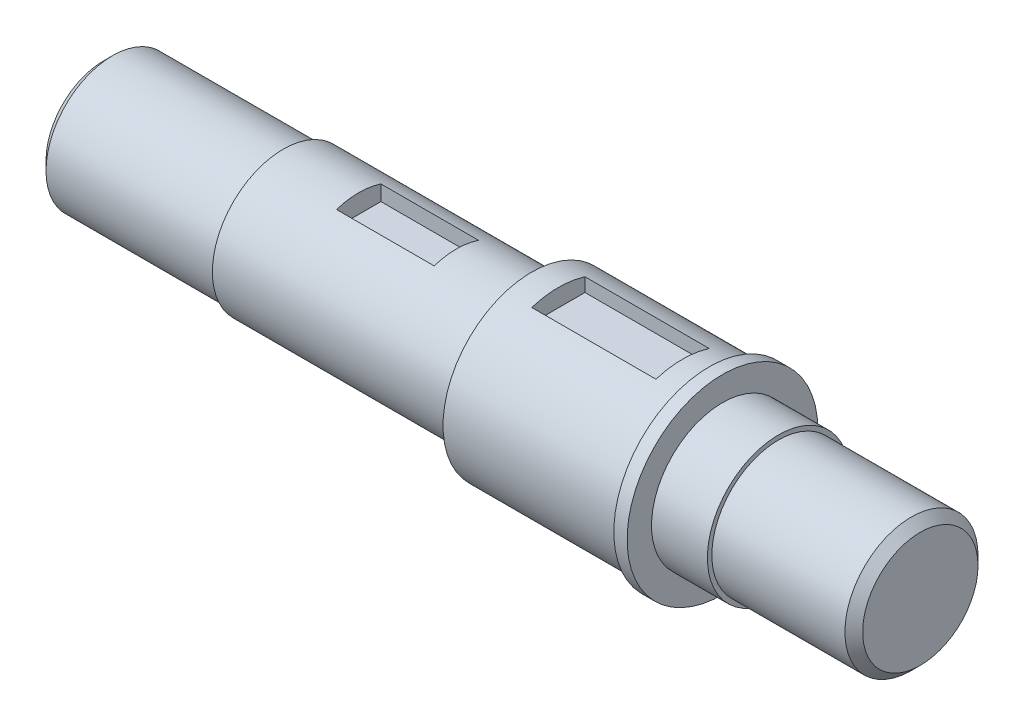
ISO-10303-21;
HEADER;
FILE_DESCRIPTION(('STEP AP214'),'2;1');
FILE_NAME('part.step','',(''),(''),'','','');
FILE_SCHEMA(('AUTOMOTIVE_DESIGN { 1 0 10303 214 1 1 1 1 }'));
ENDSEC;
DATA;
#1=APPLICATION_CONTEXT('core data for automotive mechanical design processes');
#2=APPLICATION_PROTOCOL_DEFINITION('international standard','automotive_design',2000,#1);
#3=PRODUCT_CONTEXT('',#1,'mechanical');
#4=PRODUCT('Part','Part','',(#3));
#5=PRODUCT_RELATED_PRODUCT_CATEGORY('part','',(#4));
#6=PRODUCT_DEFINITION_FORMATION('','',#4);
#7=PRODUCT_DEFINITION_CONTEXT('part definition',#1,'design');
#8=PRODUCT_DEFINITION('design','',#6,#7);
#9=PRODUCT_DEFINITION_SHAPE('','',#8);
#10=(LENGTH_UNIT() NAMED_UNIT(*) SI_UNIT(.MILLI.,.METRE.));
#11=(NAMED_UNIT(*) PLANE_ANGLE_UNIT() SI_UNIT($,.RADIAN.));
#12=(NAMED_UNIT(*) SI_UNIT($,.STERADIAN.) SOLID_ANGLE_UNIT());
#13=UNCERTAINTY_MEASURE_WITH_UNIT(LENGTH_MEASURE(1.E-05),#10,'distance_accuracy_value','');
#14=(GEOMETRIC_REPRESENTATION_CONTEXT(3) GLOBAL_UNCERTAINTY_ASSIGNED_CONTEXT((#13)) GLOBAL_UNIT_ASSIGNED_CONTEXT((#10,
#11,#12)) REPRESENTATION_CONTEXT('',''));
#15=CARTESIAN_POINT('',(0.,0.,0.));
#16=DIRECTION('',(0.,0.,1.));
#17=DIRECTION('',(1.,0.,0.));
#18=AXIS2_PLACEMENT_3D('',#15,#16,#17);
#19=CARTESIAN_POINT('',(0.,0.,0.));
#20=DIRECTION('',(-1.,0.,0.));
#21=DIRECTION('',(0.,0.,1.));
#22=AXIS2_PLACEMENT_3D('',#19,#20,#21);
#23=PLANE('',#22);
#24=CARTESIAN_POINT('',(0.,0.,0.));
#25=DIRECTION('',(-1.,0.,0.));
#26=DIRECTION('',(0.,0.,1.));
#27=AXIS2_PLACEMENT_3D('',#24,#25,#26);
#28=CIRCLE('',#27,13.);
#29=CARTESIAN_POINT('',(0.,0.,13.));
#30=VERTEX_POINT('',#29);
#31=EDGE_CURVE('E189',#30,#30,#28,.T.);
#32=ORIENTED_EDGE('',*,*,#31,.T.);
#33=EDGE_LOOP('',(#32));
#34=FACE_BOUND('',#33,.T.);
#35=ADVANCED_FACE('F35',(#34),#23,.T.);
#36=CARTESIAN_POINT('',(184.1,0.,0.));
#37=DIRECTION('',(1.,0.,0.));
#38=DIRECTION('',(0.,0.,-1.));
#39=AXIS2_PLACEMENT_3D('',#36,#37,#38);
#40=CYLINDRICAL_SURFACE('',#39,15.);
#41=CARTESIAN_POINT('',(2.00000000000003,0.,0.));
#42=DIRECTION('',(-1.,0.,0.));
#43=DIRECTION('',(0.,0.,1.));
#44=AXIS2_PLACEMENT_3D('',#41,#42,#43);
#45=CIRCLE('',#44,15.);
#46=CARTESIAN_POINT('',(2.00000000000003,0.,15.));
#47=VERTEX_POINT('',#46);
#48=EDGE_CURVE('E186',#47,#47,#45,.F.);
#49=ORIENTED_EDGE('',*,*,#48,.T.);
#50=EDGE_LOOP('',(#49));
#51=FACE_BOUND('',#50,.T.);
#52=CARTESIAN_POINT('',(40.5,0.,0.));
#53=DIRECTION('',(1.,0.,0.));
#54=DIRECTION('',(0.,0.,-1.));
#55=AXIS2_PLACEMENT_3D('',#52,#53,#54);
#56=CIRCLE('',#55,15.);
#57=CARTESIAN_POINT('',(40.5,0.,-15.));
#58=VERTEX_POINT('',#57);
#59=EDGE_CURVE('E177',#58,#58,#56,.T.);
#60=ORIENTED_EDGE('',*,*,#59,.F.);
#61=EDGE_LOOP('',(#60));
#62=FACE_BOUND('',#61,.T.);
#63=ADVANCED_FACE('F222',(#51,#62),#40,.T.);
#64=CARTESIAN_POINT('',(40.5,0.,-15.));
#65=DIRECTION('',(-1.,0.,0.));
#66=DIRECTION('',(0.,0.,1.));
#67=AXIS2_PLACEMENT_3D('',#64,#65,#66);
#68=PLANE('',#67);
#69=ORIENTED_EDGE('',*,*,#59,.T.);
#70=EDGE_LOOP('',(#69));
#71=FACE_BOUND('',#70,.T.);
#72=CARTESIAN_POINT('',(40.5,0.,0.));
#73=DIRECTION('',(1.,0.,0.));
#74=DIRECTION('',(0.,0.,-1.));
#75=AXIS2_PLACEMENT_3D('',#72,#73,#74);
#76=CIRCLE('',#75,16.);
#77=CARTESIAN_POINT('',(40.5,0.,-16.));
#78=VERTEX_POINT('',#77);
#79=EDGE_CURVE('E174',#78,#78,#76,.T.);
#80=ORIENTED_EDGE('',*,*,#79,.F.);
#81=EDGE_LOOP('',(#80));
#82=FACE_BOUND('',#81,.T.);
#83=ADVANCED_FACE('F228',(#71,#82),#68,.T.);
#84=CARTESIAN_POINT('',(184.1,0.,0.));
#85=DIRECTION('',(1.,0.,0.));
#86=DIRECTION('',(0.,0.,-1.));
#87=AXIS2_PLACEMENT_3D('',#84,#85,#86);
#88=CYLINDRICAL_SURFACE('',#87,16.);
#89=CARTESIAN_POINT('',(79.5,0.,0.));
#90=DIRECTION('',(1.,0.,0.));
#91=DIRECTION('',(0.,0.,-1.));
#92=AXIS2_PLACEMENT_3D('',#89,#90,#91);
#93=CIRCLE('',#92,16.);
#94=CARTESIAN_POINT('',(79.5,15.1986841535706,5.));
#95=VERTEX_POINT('',#94);
#96=CARTESIAN_POINT('',(79.5,15.1986841535706,-5.));
#97=VERTEX_POINT('',#96);
#98=EDGE_CURVE('E200',#95,#97,#93,.F.);
#99=ORIENTED_EDGE('',*,*,#98,.F.);
#100=DIRECTION('',(1.,0.,0.));
#101=VECTOR('',#100,1.);
#102=CARTESIAN_POINT('',(184.1,15.1986841535706,5.));
#103=LINE('',#102,#101);
#104=CARTESIAN_POINT('',(57.5,15.1986841535706,5.));
#105=VERTEX_POINT('',#104);
#106=EDGE_CURVE('E192',#95,#105,#103,.F.);
#107=ORIENTED_EDGE('',*,*,#106,.T.);
#108=CARTESIAN_POINT('',(57.5,0.,0.));
#109=DIRECTION('',(1.,0.,0.));
#110=DIRECTION('',(0.,0.,-1.));
#111=AXIS2_PLACEMENT_3D('',#108,#109,#110);
#112=CIRCLE('',#111,16.);
#113=CARTESIAN_POINT('',(57.5,15.1986841535706,-5.));
#114=VERTEX_POINT('',#113);
#115=EDGE_CURVE('E195',#105,#114,#112,.F.);
#116=ORIENTED_EDGE('',*,*,#115,.T.);
#117=DIRECTION('',(1.,0.,0.));
#118=VECTOR('',#117,1.);
#119=CARTESIAN_POINT('',(184.1,15.1986841535706,-5.));
#120=LINE('',#119,#118);
#121=EDGE_CURVE('E198',#97,#114,#120,.F.);
#122=ORIENTED_EDGE('',*,*,#121,.F.);
#123=EDGE_LOOP('',(#99,#107,#116,#122));
#124=FACE_BOUND('',#123,.T.);
#125=ORIENTED_EDGE('',*,*,#79,.T.);
#126=EDGE_LOOP('',(#125));
#127=FACE_BOUND('',#126,.T.);
#128=CARTESIAN_POINT('',(96.5,0.,0.));
#129=DIRECTION('',(1.,0.,0.));
#130=DIRECTION('',(0.,0.,-1.));
#131=AXIS2_PLACEMENT_3D('',#128,#129,#130);
#132=CIRCLE('',#131,16.);
#133=CARTESIAN_POINT('',(96.5,0.,-16.));
#134=VERTEX_POINT('',#133);
#135=EDGE_CURVE('E171',#134,#134,#132,.T.);
#136=ORIENTED_EDGE('',*,*,#135,.F.);
#137=EDGE_LOOP('',(#136));
#138=FACE_BOUND('',#137,.T.);
#139=ADVANCED_FACE('F285',(#124,#127,#138),#88,.T.);
#140=CARTESIAN_POINT('',(96.5,0.,-16.));
#141=DIRECTION('',(-1.,0.,0.));
#142=DIRECTION('',(0.,0.,1.));
#143=AXIS2_PLACEMENT_3D('',#140,#141,#142);
#144=PLANE('',#143);
#145=ORIENTED_EDGE('',*,*,#135,.T.);
#146=EDGE_LOOP('',(#145));
#147=FACE_BOUND('',#146,.T.);
#148=CARTESIAN_POINT('',(96.5,0.,0.));
#149=DIRECTION('',(1.,0.,0.));
#150=DIRECTION('',(0.,0.,-1.));
#151=AXIS2_PLACEMENT_3D('',#148,#149,#150);
#152=CIRCLE('',#151,20.);
#153=CARTESIAN_POINT('',(96.5,0.,-20.));
#154=VERTEX_POINT('',#153);
#155=EDGE_CURVE('E168',#154,#154,#152,.T.);
#156=ORIENTED_EDGE('',*,*,#155,.F.);
#157=EDGE_LOOP('',(#156));
#158=FACE_BOUND('',#157,.T.);
#159=ADVANCED_FACE('F282',(#147,#158),#144,.T.);
#160=CARTESIAN_POINT('',(184.1,0.,0.));
#161=DIRECTION('',(1.,0.,0.));
#162=DIRECTION('',(0.,0.,-1.));
#163=AXIS2_PLACEMENT_3D('',#160,#161,#162);
#164=CYLINDRICAL_SURFACE('',#163,20.);
#165=CARTESIAN_POINT('',(130.5,0.,0.));
#166=DIRECTION('',(1.,0.,0.));
#167=DIRECTION('',(0.,0.,-1.));
#168=AXIS2_PLACEMENT_3D('',#165,#166,#167);
#169=CIRCLE('',#168,20.);
#170=CARTESIAN_POINT('',(130.5,19.0787840283389,6.));
#171=VERTEX_POINT('',#170);
#172=CARTESIAN_POINT('',(130.5,19.0787840283389,-6.));
#173=VERTEX_POINT('',#172);
#174=EDGE_CURVE('E11',#171,#173,#169,.F.);
#175=ORIENTED_EDGE('',*,*,#174,.F.);
#176=DIRECTION('',(1.,0.,0.));
#177=VECTOR('',#176,1.);
#178=CARTESIAN_POINT('',(184.1,19.0787840283389,6.));
#179=LINE('',#178,#177);
#180=CARTESIAN_POINT('',(102.5,19.0787840283389,6.));
#181=VERTEX_POINT('',#180);
#182=EDGE_CURVE('E202',#171,#181,#179,.F.);
#183=ORIENTED_EDGE('',*,*,#182,.T.);
#184=CARTESIAN_POINT('',(102.5,0.,0.));
#185=DIRECTION('',(1.,0.,0.));
#186=DIRECTION('',(0.,0.,-1.));
#187=AXIS2_PLACEMENT_3D('',#184,#185,#186);
#188=CIRCLE('',#187,20.);
#189=CARTESIAN_POINT('',(102.5,19.0787840283389,-6.));
#190=VERTEX_POINT('',#189);
#191=EDGE_CURVE('E205',#181,#190,#188,.F.);
#192=ORIENTED_EDGE('',*,*,#191,.T.);
#193=DIRECTION('',(1.,0.,0.));
#194=VECTOR('',#193,1.);
#195=CARTESIAN_POINT('',(184.1,19.0787840283389,-6.));
#196=LINE('',#195,#194);
#197=EDGE_CURVE('E44',#173,#190,#196,.F.);
#198=ORIENTED_EDGE('',*,*,#197,.F.);
#199=EDGE_LOOP('',(#175,#183,#192,#198));
#200=FACE_BOUND('',#199,.T.);
#201=ORIENTED_EDGE('',*,*,#155,.T.);
#202=EDGE_LOOP('',(#201));
#203=FACE_BOUND('',#202,.T.);
#204=CARTESIAN_POINT('',(136.5,0.,0.));
#205=DIRECTION('',(1.,0.,0.));
#206=DIRECTION('',(0.,0.,-1.));
#207=AXIS2_PLACEMENT_3D('',#204,#205,#206);
#208=CIRCLE('',#207,20.);
#209=CARTESIAN_POINT('',(136.5,0.,-20.));
#210=VERTEX_POINT('',#209);
#211=EDGE_CURVE('E165',#210,#210,#208,.T.);
#212=ORIENTED_EDGE('',*,*,#211,.F.);
#213=EDGE_LOOP('',(#212));
#214=FACE_BOUND('',#213,.T.);
#215=ADVANCED_FACE('F210',(#200,#203,#214),#164,.T.);
#216=CARTESIAN_POINT('',(136.5,0.,-20.));
#217=DIRECTION('',(-1.,0.,0.));
#218=DIRECTION('',(0.,0.,1.));
#219=AXIS2_PLACEMENT_3D('',#216,#217,#218);
#220=PLANE('',#219);
#221=ORIENTED_EDGE('',*,*,#211,.T.);
#222=EDGE_LOOP('',(#221));
#223=FACE_BOUND('',#222,.T.);
#224=CARTESIAN_POINT('',(136.5,0.,0.));
#225=DIRECTION('',(1.,0.,0.));
#226=DIRECTION('',(0.,0.,-1.));
#227=AXIS2_PLACEMENT_3D('',#224,#225,#226);
#228=CIRCLE('',#227,21.5);
#229=CARTESIAN_POINT('',(136.5,0.,-21.5));
#230=VERTEX_POINT('',#229);
#231=EDGE_CURVE('E162',#230,#230,#228,.T.);
#232=ORIENTED_EDGE('',*,*,#231,.F.);
#233=EDGE_LOOP('',(#232));
#234=FACE_BOUND('',#233,.T.);
#235=ADVANCED_FACE('F275',(#223,#234),#220,.T.);
#236=CARTESIAN_POINT('',(184.1,0.,0.));
#237=DIRECTION('',(1.,0.,0.));
#238=DIRECTION('',(0.,0.,-1.));
#239=AXIS2_PLACEMENT_3D('',#236,#237,#238);
#240=CYLINDRICAL_SURFACE('',#239,21.5);
#241=ORIENTED_EDGE('',*,*,#231,.T.);
#242=EDGE_LOOP('',(#241));
#243=FACE_BOUND('',#242,.T.);
#244=CARTESIAN_POINT('',(139.5,0.,0.));
#245=DIRECTION('',(1.,0.,0.));
#246=DIRECTION('',(0.,0.,-1.));
#247=AXIS2_PLACEMENT_3D('',#244,#245,#246);
#248=CIRCLE('',#247,21.5);
#249=CARTESIAN_POINT('',(139.5,0.,-21.5));
#250=VERTEX_POINT('',#249);
#251=EDGE_CURVE('E159',#250,#250,#248,.T.);
#252=ORIENTED_EDGE('',*,*,#251,.F.);
#253=EDGE_LOOP('',(#252));
#254=FACE_BOUND('',#253,.T.);
#255=ADVANCED_FACE('F271',(#243,#254),#240,.T.);
#256=CARTESIAN_POINT('',(139.5,0.,-21.5));
#257=DIRECTION('',(1.,0.,0.));
#258=DIRECTION('',(0.,0.,-1.));
#259=AXIS2_PLACEMENT_3D('',#256,#257,#258);
#260=PLANE('',#259);
#261=ORIENTED_EDGE('',*,*,#251,.T.);
#262=EDGE_LOOP('',(#261));
#263=FACE_BOUND('',#262,.T.);
#264=CARTESIAN_POINT('',(139.5,0.,0.));
#265=DIRECTION('',(1.,0.,0.));
#266=DIRECTION('',(0.,0.,-1.));
#267=AXIS2_PLACEMENT_3D('',#264,#265,#266);
#268=CIRCLE('',#267,16.);
#269=CARTESIAN_POINT('',(139.5,0.,-16.));
#270=VERTEX_POINT('',#269);
#271=EDGE_CURVE('E156',#270,#270,#268,.T.);
#272=ORIENTED_EDGE('',*,*,#271,.F.);
#273=EDGE_LOOP('',(#272));
#274=FACE_BOUND('',#273,.T.);
#275=ADVANCED_FACE('F265',(#263,#274),#260,.T.);
#276=CARTESIAN_POINT('',(184.1,0.,0.));
#277=DIRECTION('',(1.,0.,0.));
#278=DIRECTION('',(0.,0.,-1.));
#279=AXIS2_PLACEMENT_3D('',#276,#277,#278);
#280=CYLINDRICAL_SURFACE('',#279,16.);
#281=ORIENTED_EDGE('',*,*,#271,.T.);
#282=EDGE_LOOP('',(#281));
#283=FACE_BOUND('',#282,.T.);
#284=CARTESIAN_POINT('',(152.1,0.,0.));
#285=DIRECTION('',(1.,0.,0.));
#286=DIRECTION('',(0.,0.,-1.));
#287=AXIS2_PLACEMENT_3D('',#284,#285,#286);
#288=CIRCLE('',#287,16.);
#289=CARTESIAN_POINT('',(152.1,0.,-16.));
#290=VERTEX_POINT('',#289);
#291=EDGE_CURVE('E153',#290,#290,#288,.T.);
#292=ORIENTED_EDGE('',*,*,#291,.F.);
#293=EDGE_LOOP('',(#292));
#294=FACE_BOUND('',#293,.T.);
#295=ADVANCED_FACE('F259',(#283,#294),#280,.T.);
#296=CARTESIAN_POINT('',(152.1,0.,-16.));
#297=DIRECTION('',(1.,0.,0.));
#298=DIRECTION('',(0.,0.,-1.));
#299=AXIS2_PLACEMENT_3D('',#296,#297,#298);
#300=PLANE('',#299);
#301=ORIENTED_EDGE('',*,*,#291,.T.);
#302=EDGE_LOOP('',(#301));
#303=FACE_BOUND('',#302,.T.);
#304=CARTESIAN_POINT('',(152.1,0.,0.));
#305=DIRECTION('',(1.,0.,0.));
#306=DIRECTION('',(0.,0.,-1.));
#307=AXIS2_PLACEMENT_3D('',#304,#305,#306);
#308=CIRCLE('',#307,15.);
#309=CARTESIAN_POINT('',(152.1,0.,-15.));
#310=VERTEX_POINT('',#309);
#311=EDGE_CURVE('E150',#310,#310,#308,.T.);
#312=ORIENTED_EDGE('',*,*,#311,.F.);
#313=EDGE_LOOP('',(#312));
#314=FACE_BOUND('',#313,.T.);
#315=ADVANCED_FACE('F254',(#303,#314),#300,.T.);
#316=CARTESIAN_POINT('',(184.1,0.,0.));
#317=DIRECTION('',(1.,0.,0.));
#318=DIRECTION('',(0.,0.,-1.));
#319=AXIS2_PLACEMENT_3D('',#316,#317,#318);
#320=CYLINDRICAL_SURFACE('',#319,15.);
#321=CARTESIAN_POINT('',(182.1,0.,0.));
#322=DIRECTION('',(1.,0.,0.));
#323=DIRECTION('',(0.,0.,-1.));
#324=AXIS2_PLACEMENT_3D('',#321,#322,#323);
#325=CIRCLE('',#324,15.);
#326=CARTESIAN_POINT('',(182.1,0.,-15.));
#327=VERTEX_POINT('',#326);
#328=EDGE_CURVE('E183',#327,#327,#325,.F.);
#329=ORIENTED_EDGE('',*,*,#328,.T.);
#330=EDGE_LOOP('',(#329));
#331=FACE_BOUND('',#330,.T.);
#332=ORIENTED_EDGE('',*,*,#311,.T.);
#333=EDGE_LOOP('',(#332));
#334=FACE_BOUND('',#333,.T.);
#335=ADVANCED_FACE('F245',(#331,#334),#320,.T.);
#336=CARTESIAN_POINT('',(184.1,0.,-15.));
#337=DIRECTION('',(1.,0.,0.));
#338=DIRECTION('',(0.,0.,-1.));
#339=AXIS2_PLACEMENT_3D('',#336,#337,#338);
#340=PLANE('',#339);
#341=CARTESIAN_POINT('',(184.1,0.,0.));
#342=DIRECTION('',(1.,0.,0.));
#343=DIRECTION('',(0.,0.,-1.));
#344=AXIS2_PLACEMENT_3D('',#341,#342,#343);
#345=CIRCLE('',#344,13.);
#346=CARTESIAN_POINT('',(184.1,0.,-13.));
#347=VERTEX_POINT('',#346);
#348=EDGE_CURVE('E180',#347,#347,#345,.T.);
#349=ORIENTED_EDGE('',*,*,#348,.T.);
#350=EDGE_LOOP('',(#349));
#351=FACE_BOUND('',#350,.T.);
#352=ADVANCED_FACE('F237',(#351),#340,.T.);
#353=CARTESIAN_POINT('',(184.1,0.,0.));
#354=DIRECTION('',(-1.,0.,0.));
#355=DIRECTION('',(0.,0.,1.));
#356=AXIS2_PLACEMENT_3D('',#353,#354,#355);
#357=CONICAL_SURFACE('',#356,13.,0.785398163397451);
#358=ORIENTED_EDGE('',*,*,#328,.F.);
#359=EDGE_LOOP('',(#358));
#360=FACE_BOUND('',#359,.T.);
#361=ORIENTED_EDGE('',*,*,#348,.F.);
#362=EDGE_LOOP('',(#361));
#363=FACE_BOUND('',#362,.T.);
#364=ADVANCED_FACE('F233',(#360,#363),#357,.T.);
#365=CARTESIAN_POINT('',(2.00000000000003,0.,0.));
#366=DIRECTION('',(1.,0.,0.));
#367=DIRECTION('',(0.,0.,-1.));
#368=AXIS2_PLACEMENT_3D('',#365,#366,#367);
#369=CONICAL_SURFACE('',#368,15.,0.785398163397448);
#370=ORIENTED_EDGE('',*,*,#31,.F.);
#371=EDGE_LOOP('',(#370));
#372=FACE_BOUND('',#371,.T.);
#373=ORIENTED_EDGE('',*,*,#48,.F.);
#374=EDGE_LOOP('',(#373));
#375=FACE_BOUND('',#374,.T.);
#376=ADVANCED_FACE('F38',(#372,#375),#369,.T.);
#377=CARTESIAN_POINT('',(79.5,36.75,0.));
#378=DIRECTION('',(1.,0.,0.));
#379=DIRECTION('',(0.,0.,-1.));
#380=AXIS2_PLACEMENT_3D('',#377,#378,#379);
#381=PLANE('',#380);
#382=ORIENTED_EDGE('',*,*,#98,.T.);
#383=DIRECTION('',(0.,-1.,0.));
#384=VECTOR('',#383,1.);
#385=CARTESIAN_POINT('',(79.5,36.75,-5.));
#386=LINE('',#385,#384);
#387=CARTESIAN_POINT('',(79.5,11.75,-5.));
#388=VERTEX_POINT('',#387);
#389=EDGE_CURVE('E148',#97,#388,#386,.T.);
#390=ORIENTED_EDGE('',*,*,#389,.T.);
#391=DIRECTION('',(0.,0.,1.));
#392=VECTOR('',#391,1.);
#393=CARTESIAN_POINT('',(79.5,11.75,0.));
#394=LINE('',#393,#392);
#395=CARTESIAN_POINT('',(79.5,11.75,5.));
#396=VERTEX_POINT('',#395);
#397=EDGE_CURVE('E109',#388,#396,#394,.T.);
#398=ORIENTED_EDGE('',*,*,#397,.T.);
#399=DIRECTION('',(0.,-1.,0.));
#400=VECTOR('',#399,1.);
#401=CARTESIAN_POINT('',(79.5,36.75,5.));
#402=LINE('',#401,#400);
#403=EDGE_CURVE('E143',#95,#396,#402,.T.);
#404=ORIENTED_EDGE('',*,*,#403,.F.);
#405=EDGE_LOOP('',(#382,#390,#398,#404));
#406=FACE_BOUND('',#405,.T.);
#407=ADVANCED_FACE('F243',(#406),#381,.F.);
#408=CARTESIAN_POINT('',(0.,36.75,-5.));
#409=DIRECTION('',(0.,0.,-1.));
#410=DIRECTION('',(-1.,0.,0.));
#411=AXIS2_PLACEMENT_3D('',#408,#409,#410);
#412=PLANE('',#411);
#413=ORIENTED_EDGE('',*,*,#121,.T.);
#414=DIRECTION('',(0.,-1.,0.));
#415=VECTOR('',#414,1.);
#416=CARTESIAN_POINT('',(57.5,36.75,-5.));
#417=LINE('',#416,#415);
#418=CARTESIAN_POINT('',(57.5,11.75,-5.));
#419=VERTEX_POINT('',#418);
#420=EDGE_CURVE('E146',#114,#419,#417,.T.);
#421=ORIENTED_EDGE('',*,*,#420,.T.);
#422=DIRECTION('',(1.,0.,0.));
#423=VECTOR('',#422,1.);
#424=CARTESIAN_POINT('',(0.,11.75,-5.));
#425=LINE('',#424,#423);
#426=EDGE_CURVE('E134',#419,#388,#425,.T.);
#427=ORIENTED_EDGE('',*,*,#426,.T.);
#428=ORIENTED_EDGE('',*,*,#389,.F.);
#429=EDGE_LOOP('',(#413,#421,#427,#428));
#430=FACE_BOUND('',#429,.T.);
#431=ADVANCED_FACE('F387',(#430),#412,.F.);
#432=CARTESIAN_POINT('',(57.5,36.75,0.));
#433=DIRECTION('',(1.,0.,0.));
#434=DIRECTION('',(0.,0.,-1.));
#435=AXIS2_PLACEMENT_3D('',#432,#433,#434);
#436=PLANE('',#435);
#437=DIRECTION('',(0.,-1.,0.));
#438=VECTOR('',#437,1.);
#439=CARTESIAN_POINT('',(57.5,36.75,5.));
#440=LINE('',#439,#438);
#441=CARTESIAN_POINT('',(57.5,11.75,5.));
#442=VERTEX_POINT('',#441);
#443=EDGE_CURVE('E59',#105,#442,#440,.T.);
#444=ORIENTED_EDGE('',*,*,#443,.T.);
#445=DIRECTION('',(0.,0.,1.));
#446=VECTOR('',#445,1.);
#447=CARTESIAN_POINT('',(57.5,11.75,0.));
#448=LINE('',#447,#446);
#449=EDGE_CURVE('E137',#419,#442,#448,.T.);
#450=ORIENTED_EDGE('',*,*,#449,.F.);
#451=ORIENTED_EDGE('',*,*,#420,.F.);
#452=ORIENTED_EDGE('',*,*,#115,.F.);
#453=EDGE_LOOP('',(#444,#450,#451,#452));
#454=FACE_BOUND('',#453,.T.);
#455=ADVANCED_FACE('F394',(#454),#436,.T.);
#456=CARTESIAN_POINT('',(0.,36.75,5.));
#457=DIRECTION('',(0.,0.,-1.));
#458=DIRECTION('',(-1.,0.,0.));
#459=AXIS2_PLACEMENT_3D('',#456,#457,#458);
#460=PLANE('',#459);
#461=ORIENTED_EDGE('',*,*,#403,.T.);
#462=DIRECTION('',(1.,0.,0.));
#463=VECTOR('',#462,1.);
#464=CARTESIAN_POINT('',(0.,11.75,5.));
#465=LINE('',#464,#463);
#466=EDGE_CURVE('E140',#442,#396,#465,.T.);
#467=ORIENTED_EDGE('',*,*,#466,.F.);
#468=ORIENTED_EDGE('',*,*,#443,.F.);
#469=ORIENTED_EDGE('',*,*,#106,.F.);
#470=EDGE_LOOP('',(#461,#467,#468,#469));
#471=FACE_BOUND('',#470,.T.);
#472=ADVANCED_FACE('F402',(#471),#460,.T.);
#473=CARTESIAN_POINT('',(0.,11.75,0.));
#474=DIRECTION('',(0.,1.,0.));
#475=DIRECTION('',(0.,0.,1.));
#476=AXIS2_PLACEMENT_3D('',#473,#474,#475);
#477=PLANE('',#476);
#478=ORIENTED_EDGE('',*,*,#397,.F.);
#479=ORIENTED_EDGE('',*,*,#426,.F.);
#480=ORIENTED_EDGE('',*,*,#449,.T.);
#481=ORIENTED_EDGE('',*,*,#466,.T.);
#482=EDGE_LOOP('',(#478,#479,#480,#481));
#483=FACE_BOUND('',#482,.T.);
#484=ADVANCED_FACE('F410',(#483),#477,.T.);
#485=CARTESIAN_POINT('',(130.5,27.,0.));
#486=DIRECTION('',(1.,0.,0.));
#487=DIRECTION('',(0.,0.,-1.));
#488=AXIS2_PLACEMENT_3D('',#485,#486,#487);
#489=PLANE('',#488);
#490=ORIENTED_EDGE('',*,*,#174,.T.);
#491=DIRECTION('',(0.,-1.,0.));
#492=VECTOR('',#491,1.);
#493=CARTESIAN_POINT('',(130.5,27.,-6.));
#494=LINE('',#493,#492);
#495=CARTESIAN_POINT('',(130.5,16.,-6.));
#496=VERTEX_POINT('',#495);
#497=EDGE_CURVE('E100',#173,#496,#494,.T.);
#498=ORIENTED_EDGE('',*,*,#497,.T.);
#499=DIRECTION('',(0.,0.,1.));
#500=VECTOR('',#499,1.);
#501=CARTESIAN_POINT('',(130.5,16.,0.));
#502=LINE('',#501,#500);
#503=CARTESIAN_POINT('',(130.5,16.,6.));
#504=VERTEX_POINT('',#503);
#505=EDGE_CURVE('E104',#496,#504,#502,.T.);
#506=ORIENTED_EDGE('',*,*,#505,.T.);
#507=DIRECTION('',(0.,-1.,0.));
#508=VECTOR('',#507,1.);
#509=CARTESIAN_POINT('',(130.5,27.,6.));
#510=LINE('',#509,#508);
#511=EDGE_CURVE('E128',#171,#504,#510,.T.);
#512=ORIENTED_EDGE('',*,*,#511,.F.);
#513=EDGE_LOOP('',(#490,#498,#506,#512));
#514=FACE_BOUND('',#513,.T.);
#515=ADVANCED_FACE('F102',(#514),#489,.F.);
#516=CARTESIAN_POINT('',(0.,27.,-6.));
#517=DIRECTION('',(0.,0.,-1.));
#518=DIRECTION('',(-1.,0.,0.));
#519=AXIS2_PLACEMENT_3D('',#516,#517,#518);
#520=PLANE('',#519);
#521=ORIENTED_EDGE('',*,*,#197,.T.);
#522=DIRECTION('',(0.,-1.,0.));
#523=VECTOR('',#522,1.);
#524=CARTESIAN_POINT('',(102.5,27.,-6.));
#525=LINE('',#524,#523);
#526=CARTESIAN_POINT('',(102.5,16.,-6.));
#527=VERTEX_POINT('',#526);
#528=EDGE_CURVE('E110',#190,#527,#525,.T.);
#529=ORIENTED_EDGE('',*,*,#528,.T.);
#530=DIRECTION('',(1.,0.,0.));
#531=VECTOR('',#530,1.);
#532=CARTESIAN_POINT('',(0.,16.,-6.));
#533=LINE('',#532,#531);
#534=EDGE_CURVE('E117',#527,#496,#533,.T.);
#535=ORIENTED_EDGE('',*,*,#534,.T.);
#536=ORIENTED_EDGE('',*,*,#497,.F.);
#537=EDGE_LOOP('',(#521,#529,#535,#536));
#538=FACE_BOUND('',#537,.T.);
#539=ADVANCED_FACE('F120',(#538),#520,.F.);
#540=CARTESIAN_POINT('',(102.5,27.,0.));
#541=DIRECTION('',(1.,0.,0.));
#542=DIRECTION('',(0.,0.,-1.));
#543=AXIS2_PLACEMENT_3D('',#540,#541,#542);
#544=PLANE('',#543);
#545=DIRECTION('',(0.,-1.,0.));
#546=VECTOR('',#545,1.);
#547=CARTESIAN_POINT('',(102.5,27.,6.));
#548=LINE('',#547,#546);
#549=CARTESIAN_POINT('',(102.5,16.,6.));
#550=VERTEX_POINT('',#549);
#551=EDGE_CURVE('E51',#181,#550,#548,.T.);
#552=ORIENTED_EDGE('',*,*,#551,.T.);
#553=DIRECTION('',(0.,0.,1.));
#554=VECTOR('',#553,1.);
#555=CARTESIAN_POINT('',(102.5,16.,0.));
#556=LINE('',#555,#554);
#557=EDGE_CURVE('E123',#527,#550,#556,.T.);
#558=ORIENTED_EDGE('',*,*,#557,.F.);
#559=ORIENTED_EDGE('',*,*,#528,.F.);
#560=ORIENTED_EDGE('',*,*,#191,.F.);
#561=EDGE_LOOP('',(#552,#558,#559,#560));
#562=FACE_BOUND('',#561,.T.);
#563=ADVANCED_FACE('F209',(#562),#544,.T.);
#564=CARTESIAN_POINT('',(0.,27.,6.));
#565=DIRECTION('',(0.,0.,-1.));
#566=DIRECTION('',(-1.,0.,0.));
#567=AXIS2_PLACEMENT_3D('',#564,#565,#566);
#568=PLANE('',#567);
#569=ORIENTED_EDGE('',*,*,#511,.T.);
#570=DIRECTION('',(1.,0.,0.));
#571=VECTOR('',#570,1.);
#572=CARTESIAN_POINT('',(0.,16.,6.));
#573=LINE('',#572,#571);
#574=EDGE_CURVE('E118',#550,#504,#573,.T.);
#575=ORIENTED_EDGE('',*,*,#574,.F.);
#576=ORIENTED_EDGE('',*,*,#551,.F.);
#577=ORIENTED_EDGE('',*,*,#182,.F.);
#578=EDGE_LOOP('',(#569,#575,#576,#577));
#579=FACE_BOUND('',#578,.T.);
#580=ADVANCED_FACE('F212',(#579),#568,.T.);
#581=CARTESIAN_POINT('',(0.,16.,0.));
#582=DIRECTION('',(0.,1.,0.));
#583=DIRECTION('',(0.,0.,1.));
#584=AXIS2_PLACEMENT_3D('',#581,#582,#583);
#585=PLANE('',#584);
#586=ORIENTED_EDGE('',*,*,#505,.F.);
#587=ORIENTED_EDGE('',*,*,#534,.F.);
#588=ORIENTED_EDGE('',*,*,#557,.T.);
#589=ORIENTED_EDGE('',*,*,#574,.T.);
#590=EDGE_LOOP('',(#586,#587,#588,#589));
#591=FACE_BOUND('',#590,.T.);
#592=ADVANCED_FACE('F115',(#591),#585,.T.);
#593=CLOSED_SHELL('',(#35,#63,#83,#139,#159,#215,#235,#255,#275,#295,#315,#335,#352,#364,#376,
#407,#431,#455,#472,#484,#515,#539,#563,#580,#592));
#594=MANIFOLD_SOLID_BREP('B2',#593);
#595=ADVANCED_BREP_SHAPE_REPRESENTATION('',(#18,#594),#14);
#596=SHAPE_DEFINITION_REPRESENTATION(#9,#595);
ENDSEC;
END-ISO-10303-21;
